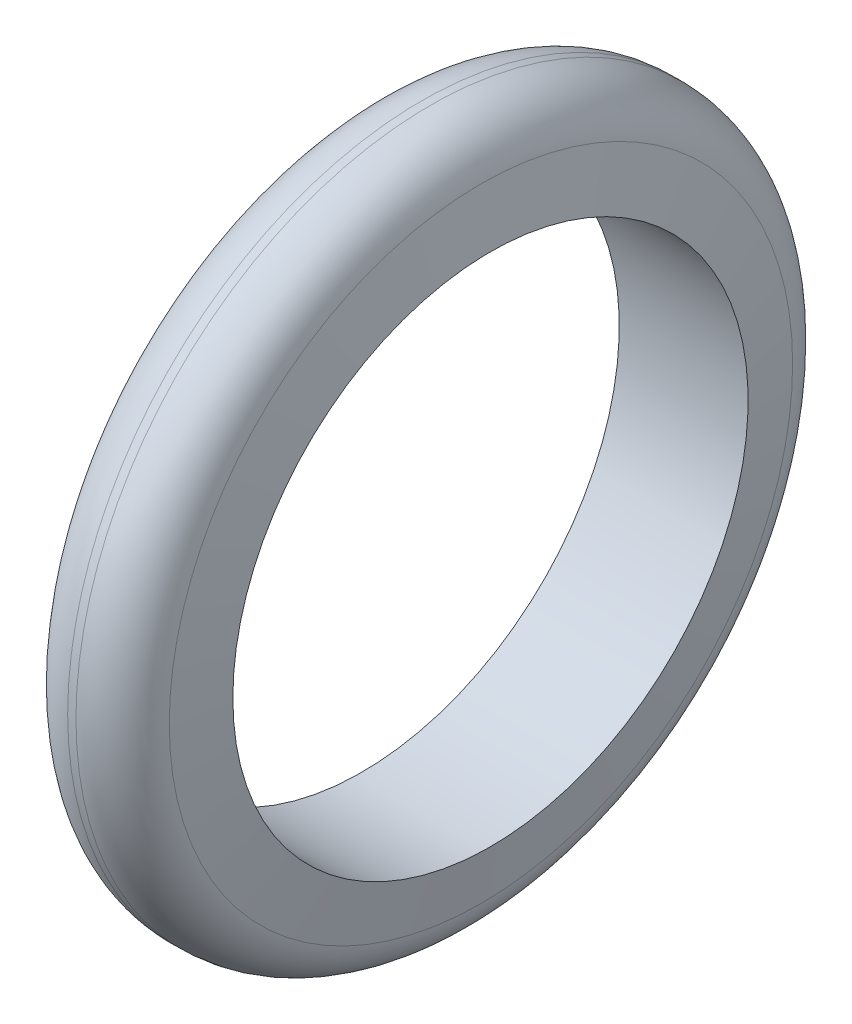
ISO-10303-21;
HEADER;
FILE_DESCRIPTION(('STEP AP214'),'2;1');
FILE_NAME('part.step','',(''),(''),'','','');
FILE_SCHEMA(('AUTOMOTIVE_DESIGN { 1 0 10303 214 1 1 1 1 }'));
ENDSEC;
DATA;
#1=APPLICATION_CONTEXT('core data for automotive mechanical design processes');
#2=APPLICATION_PROTOCOL_DEFINITION('international standard','automotive_design',2000,#1);
#3=PRODUCT_CONTEXT('',#1,'mechanical');
#4=PRODUCT('Part','Part','',(#3));
#5=PRODUCT_RELATED_PRODUCT_CATEGORY('part','',(#4));
#6=PRODUCT_DEFINITION_FORMATION('','',#4);
#7=PRODUCT_DEFINITION_CONTEXT('part definition',#1,'design');
#8=PRODUCT_DEFINITION('design','',#6,#7);
#9=PRODUCT_DEFINITION_SHAPE('','',#8);
#10=(LENGTH_UNIT() NAMED_UNIT(*) SI_UNIT(.MILLI.,.METRE.));
#11=(NAMED_UNIT(*) PLANE_ANGLE_UNIT() SI_UNIT($,.RADIAN.));
#12=(NAMED_UNIT(*) SI_UNIT($,.STERADIAN.) SOLID_ANGLE_UNIT());
#13=UNCERTAINTY_MEASURE_WITH_UNIT(LENGTH_MEASURE(1.E-05),#10,'distance_accuracy_value','');
#14=(GEOMETRIC_REPRESENTATION_CONTEXT(3) GLOBAL_UNCERTAINTY_ASSIGNED_CONTEXT((#13)) GLOBAL_UNIT_ASSIGNED_CONTEXT((#10,
#11,#12)) REPRESENTATION_CONTEXT('',''));
#15=CARTESIAN_POINT('',(0.,0.,0.));
#16=DIRECTION('',(0.,0.,1.));
#17=DIRECTION('',(1.,0.,0.));
#18=AXIS2_PLACEMENT_3D('',#15,#16,#17);
#19=CARTESIAN_POINT('',(-7.35509528937291,0.,0.));
#20=DIRECTION('',(1.,0.,0.));
#21=DIRECTION('',(0.,0.,-1.));
#22=AXIS2_PLACEMENT_3D('',#19,#20,#21);
#23=CONICAL_SURFACE('',#22,55.,1.39626340159546);
#24=CARTESIAN_POINT('',(-8.52076026405237,0.,0.));
#25=DIRECTION('',(-1.,0.,0.));
#26=DIRECTION('',(0.,0.,1.));
#27=AXIS2_PLACEMENT_3D('',#24,#25,#26);
#28=CIRCLE('',#27,48.3891854213355);
#29=CARTESIAN_POINT('',(-8.52076026405237,0.,48.3891854213355));
#30=VERTEX_POINT('',#29);
#31=EDGE_CURVE('E37',#30,#30,#28,.T.);
#32=ORIENTED_EDGE('',*,*,#31,.T.);
#33=EDGE_LOOP('',(#32));
#34=FACE_BOUND('',#33,.T.);
#35=CARTESIAN_POINT('',(-10.,0.,0.));
#36=DIRECTION('',(-1.,0.,0.));
#37=DIRECTION('',(0.,0.,1.));
#38=AXIS2_PLACEMENT_3D('',#35,#36,#37);
#39=CIRCLE('',#38,40.);
#40=CARTESIAN_POINT('',(-10.,0.,40.));
#41=VERTEX_POINT('',#40);
#42=EDGE_CURVE('E53',#41,#41,#39,.T.);
#43=ORIENTED_EDGE('',*,*,#42,.F.);
#44=EDGE_LOOP('',(#43));
#45=FACE_BOUND('',#44,.T.);
#46=ADVANCED_FACE('F30',(#34,#45),#23,.T.);
#47=CARTESIAN_POINT('',(0.,0.,0.));
#48=DIRECTION('',(-1.,0.,0.));
#49=DIRECTION('',(0.,0.,1.));
#50=AXIS2_PLACEMENT_3D('',#47,#48,#49);
#51=CYLINDRICAL_SURFACE('',#50,55.);
#52=CARTESIAN_POINT('',(-0.64229823995472,0.,0.));
#53=DIRECTION('',(1.,0.,0.));
#54=DIRECTION('',(0.,0.,-1.));
#55=AXIS2_PLACEMENT_3D('',#52,#53,#54);
#56=CIRCLE('',#55,55.);
#57=CARTESIAN_POINT('',(-0.64229823995472,0.,-55.));
#58=VERTEX_POINT('',#57);
#59=EDGE_CURVE('E10',#58,#58,#56,.T.);
#60=ORIENTED_EDGE('',*,*,#59,.T.);
#61=EDGE_LOOP('',(#60));
#62=FACE_BOUND('',#61,.T.);
#63=CARTESIAN_POINT('',(0.642298239954722,0.,0.));
#64=DIRECTION('',(1.,0.,0.));
#65=DIRECTION('',(0.,0.,-1.));
#66=AXIS2_PLACEMENT_3D('',#63,#64,#65);
#67=CIRCLE('',#66,55.);
#68=CARTESIAN_POINT('',(0.642298239954722,0.,-55.));
#69=VERTEX_POINT('',#68);
#70=EDGE_CURVE('E45',#69,#69,#67,.F.);
#71=ORIENTED_EDGE('',*,*,#70,.T.);
#72=EDGE_LOOP('',(#71));
#73=FACE_BOUND('',#72,.T.);
#74=ADVANCED_FACE('F60',(#62,#73),#51,.T.);
#75=CARTESIAN_POINT('',(10.,0.,0.));
#76=DIRECTION('',(-1.,0.,0.));
#77=DIRECTION('',(0.,0.,1.));
#78=AXIS2_PLACEMENT_3D('',#75,#76,#77);
#79=CONICAL_SURFACE('',#78,40.,1.39626340159546);
#80=CARTESIAN_POINT('',(8.52076026405237,0.,0.));
#81=DIRECTION('',(1.,0.,0.));
#82=DIRECTION('',(0.,0.,-1.));
#83=AXIS2_PLACEMENT_3D('',#80,#81,#82);
#84=CIRCLE('',#83,48.3891854213355);
#85=CARTESIAN_POINT('',(8.52076026405237,0.,-48.3891854213355));
#86=VERTEX_POINT('',#85);
#87=EDGE_CURVE('E41',#86,#86,#84,.T.);
#88=ORIENTED_EDGE('',*,*,#87,.T.);
#89=EDGE_LOOP('',(#88));
#90=FACE_BOUND('',#89,.T.);
#91=CARTESIAN_POINT('',(10.,0.,0.));
#92=DIRECTION('',(-1.,0.,0.));
#93=DIRECTION('',(0.,0.,1.));
#94=AXIS2_PLACEMENT_3D('',#91,#92,#93);
#95=CIRCLE('',#94,40.);
#96=CARTESIAN_POINT('',(10.,0.,40.));
#97=VERTEX_POINT('',#96);
#98=EDGE_CURVE('E50',#97,#97,#95,.T.);
#99=ORIENTED_EDGE('',*,*,#98,.T.);
#100=EDGE_LOOP('',(#99));
#101=FACE_BOUND('',#100,.T.);
#102=ADVANCED_FACE('F65',(#90,#101),#79,.T.);
#103=CARTESIAN_POINT('',(0.,0.,0.));
#104=DIRECTION('',(-1.,0.,0.));
#105=DIRECTION('',(0.,0.,1.));
#106=AXIS2_PLACEMENT_3D('',#103,#104,#105);
#107=CYLINDRICAL_SURFACE('',#106,40.);
#108=ORIENTED_EDGE('',*,*,#98,.F.);
#109=EDGE_LOOP('',(#108));
#110=FACE_BOUND('',#109,.T.);
#111=ORIENTED_EDGE('',*,*,#42,.T.);
#112=EDGE_LOOP('',(#111));
#113=FACE_BOUND('',#112,.T.);
#114=ADVANCED_FACE('F57',(#110,#113),#107,.F.);
#115=CARTESIAN_POINT('',(0.642298239954722,0.,0.));
#116=DIRECTION('',(1.,0.,0.));
#117=DIRECTION('',(0.,0.,-1.));
#118=AXIS2_PLACEMENT_3D('',#115,#116,#117);
#119=TOROIDAL_SURFACE('',#118,47.,8.);
#120=ORIENTED_EDGE('',*,*,#87,.F.);
#121=EDGE_LOOP('',(#120));
#122=FACE_BOUND('',#121,.T.);
#123=ORIENTED_EDGE('',*,*,#70,.F.);
#124=EDGE_LOOP('',(#123));
#125=FACE_BOUND('',#124,.T.);
#126=ADVANCED_FACE('F68',(#122,#125),#119,.T.);
#127=CARTESIAN_POINT('',(-0.64229823995472,0.,0.));
#128=DIRECTION('',(1.,0.,0.));
#129=DIRECTION('',(0.,0.,-1.));
#130=AXIS2_PLACEMENT_3D('',#127,#128,#129);
#131=TOROIDAL_SURFACE('',#130,47.,8.);
#132=ORIENTED_EDGE('',*,*,#59,.F.);
#133=EDGE_LOOP('',(#132));
#134=FACE_BOUND('',#133,.T.);
#135=ORIENTED_EDGE('',*,*,#31,.F.);
#136=EDGE_LOOP('',(#135));
#137=FACE_BOUND('',#136,.T.);
#138=ADVANCED_FACE('F32',(#134,#137),#131,.T.);
#139=CLOSED_SHELL('',(#46,#74,#102,#114,#126,#138));
#140=MANIFOLD_SOLID_BREP('B2',#139);
#141=ADVANCED_BREP_SHAPE_REPRESENTATION('',(#18,#140),#14);
#142=SHAPE_DEFINITION_REPRESENTATION(#9,#141);
ENDSEC;
END-ISO-10303-21;
